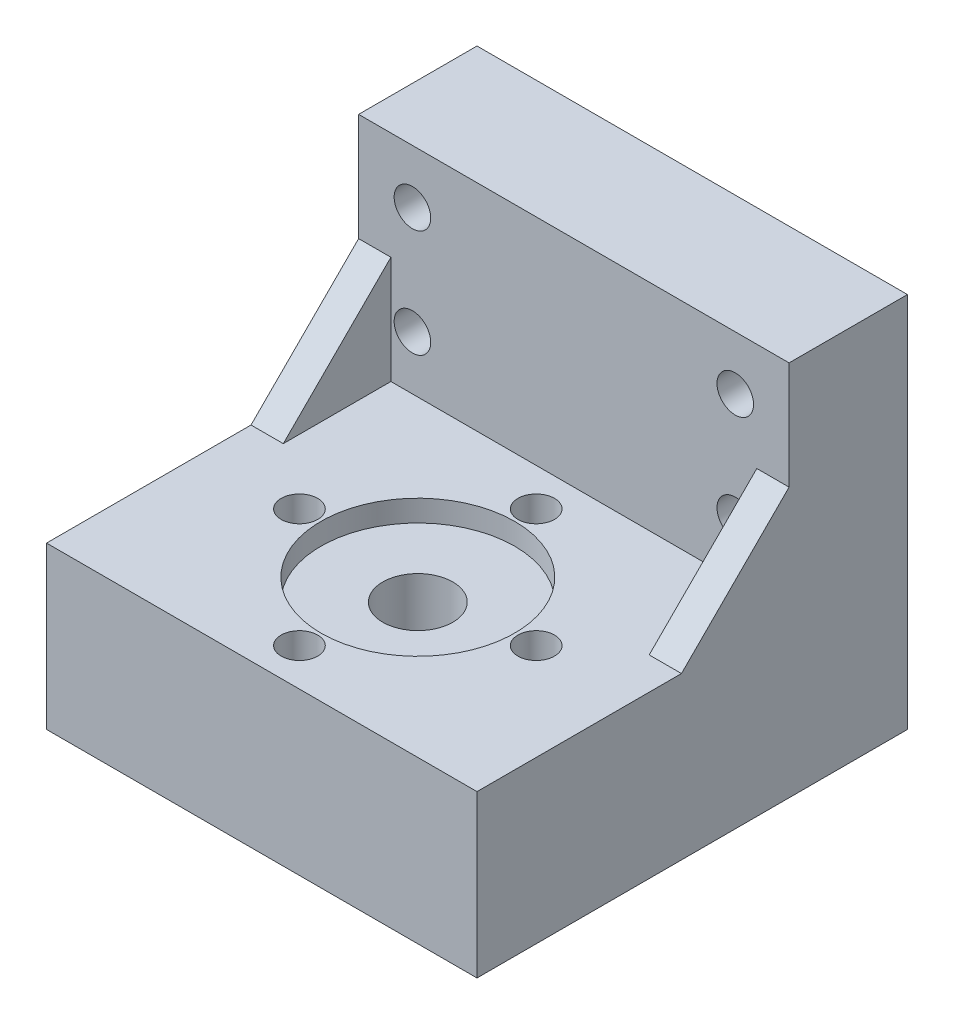
ISO-10303-21;
HEADER;
FILE_DESCRIPTION(('STEP AP214'),'2;1');
FILE_NAME('part.step','',(''),(''),'','','');
FILE_SCHEMA(('AUTOMOTIVE_DESIGN { 1 0 10303 214 1 1 1 1 }'));
ENDSEC;
DATA;
#1=APPLICATION_CONTEXT('core data for automotive mechanical design processes');
#2=APPLICATION_PROTOCOL_DEFINITION('international standard','automotive_design',2000,#1);
#3=PRODUCT_CONTEXT('',#1,'mechanical');
#4=PRODUCT('Part','Part','',(#3));
#5=PRODUCT_RELATED_PRODUCT_CATEGORY('part','',(#4));
#6=PRODUCT_DEFINITION_FORMATION('','',#4);
#7=PRODUCT_DEFINITION_CONTEXT('part definition',#1,'design');
#8=PRODUCT_DEFINITION('design','',#6,#7);
#9=PRODUCT_DEFINITION_SHAPE('','',#8);
#10=(LENGTH_UNIT() NAMED_UNIT(*) SI_UNIT(.MILLI.,.METRE.));
#11=(NAMED_UNIT(*) PLANE_ANGLE_UNIT() SI_UNIT($,.RADIAN.));
#12=(NAMED_UNIT(*) SI_UNIT($,.STERADIAN.) SOLID_ANGLE_UNIT());
#13=UNCERTAINTY_MEASURE_WITH_UNIT(LENGTH_MEASURE(1.E-05),#10,'distance_accuracy_value','');
#14=(GEOMETRIC_REPRESENTATION_CONTEXT(3) GLOBAL_UNCERTAINTY_ASSIGNED_CONTEXT((#13)) GLOBAL_UNIT_ASSIGNED_CONTEXT((#10,
#11,#12)) REPRESENTATION_CONTEXT('',''));
#15=CARTESIAN_POINT('',(0.,0.,0.));
#16=DIRECTION('',(0.,0.,1.));
#17=DIRECTION('',(1.,0.,0.));
#18=AXIS2_PLACEMENT_3D('',#15,#16,#17);
#19=CARTESIAN_POINT('',(40.,15.,-29.));
#20=DIRECTION('',(0.,0.,1.));
#21=DIRECTION('',(1.,0.,0.));
#22=AXIS2_PLACEMENT_3D('',#19,#20,#21);
#23=PLANE('',#22);
#24=DIRECTION('',(-1.,0.,0.));
#25=VECTOR('',#24,1.);
#26=CARTESIAN_POINT('',(3.,25.,-29.));
#27=LINE('',#26,#25);
#28=CARTESIAN_POINT('',(3.,25.,-29.));
#29=VERTEX_POINT('',#28);
#30=CARTESIAN_POINT('',(0.,25.,-29.));
#31=VERTEX_POINT('',#30);
#32=EDGE_CURVE('E131',#29,#31,#27,.T.);
#33=ORIENTED_EDGE('',*,*,#32,.F.);
#34=DIRECTION('',(0.,1.,0.));
#35=VECTOR('',#34,1.);
#36=CARTESIAN_POINT('',(3.,25.,-29.));
#37=LINE('',#36,#35);
#38=CARTESIAN_POINT('',(3.,15.,-29.));
#39=VERTEX_POINT('',#38);
#40=EDGE_CURVE('E124',#39,#29,#37,.T.);
#41=ORIENTED_EDGE('',*,*,#40,.F.);
#42=DIRECTION('',(-1.,0.,0.));
#43=VECTOR('',#42,1.);
#44=CARTESIAN_POINT('',(40.,15.,-29.));
#45=LINE('',#44,#43);
#46=CARTESIAN_POINT('',(37.,15.,-29.));
#47=VERTEX_POINT('',#46);
#48=EDGE_CURVE('E139',#47,#39,#45,.T.);
#49=ORIENTED_EDGE('',*,*,#48,.F.);
#50=DIRECTION('',(0.,1.,0.));
#51=VECTOR('',#50,1.);
#52=CARTESIAN_POINT('',(37.,25.,-29.));
#53=LINE('',#52,#51);
#54=CARTESIAN_POINT('',(37.,25.,-29.));
#55=VERTEX_POINT('',#54);
#56=EDGE_CURVE('E63',#47,#55,#53,.T.);
#57=ORIENTED_EDGE('',*,*,#56,.T.);
#58=DIRECTION('',(1.,0.,0.));
#59=VECTOR('',#58,1.);
#60=CARTESIAN_POINT('',(37.,25.,-29.));
#61=LINE('',#60,#59);
#62=CARTESIAN_POINT('',(40.,25.,-29.));
#63=VERTEX_POINT('',#62);
#64=EDGE_CURVE('E147',#55,#63,#61,.T.);
#65=ORIENTED_EDGE('',*,*,#64,.T.);
#66=DIRECTION('',(0.,1.,0.));
#67=VECTOR('',#66,1.);
#68=CARTESIAN_POINT('',(40.,15.,-29.));
#69=LINE('',#68,#67);
#70=CARTESIAN_POINT('',(40.,35.,-29.));
#71=VERTEX_POINT('',#70);
#72=EDGE_CURVE('E223',#63,#71,#69,.T.);
#73=ORIENTED_EDGE('',*,*,#72,.T.);
#74=DIRECTION('',(-1.,0.,0.));
#75=VECTOR('',#74,1.);
#76=CARTESIAN_POINT('',(40.,35.,-29.));
#77=LINE('',#76,#75);
#78=CARTESIAN_POINT('',(0.,35.,-29.));
#79=VERTEX_POINT('',#78);
#80=EDGE_CURVE('E255',#71,#79,#77,.T.);
#81=ORIENTED_EDGE('',*,*,#80,.T.);
#82=DIRECTION('',(0.,1.,0.));
#83=VECTOR('',#82,1.);
#84=CARTESIAN_POINT('',(0.,15.,-29.));
#85=LINE('',#84,#83);
#86=EDGE_CURVE('E237',#31,#79,#85,.T.);
#87=ORIENTED_EDGE('',*,*,#86,.F.);
#88=EDGE_LOOP('',(#33,#41,#49,#57,#65,#73,#81,#87));
#89=FACE_BOUND('',#88,.T.);
#90=CARTESIAN_POINT('',(35.,30.,-29.));
#91=DIRECTION('',(0.,0.,1.));
#92=DIRECTION('',(1.,0.,0.));
#93=AXIS2_PLACEMENT_3D('',#90,#91,#92);
#94=CIRCLE('',#93,1.7);
#95=CARTESIAN_POINT('',(36.7,30.,-29.));
#96=VERTEX_POINT('',#95);
#97=EDGE_CURVE('E165',#96,#96,#94,.T.);
#98=ORIENTED_EDGE('',*,*,#97,.F.);
#99=EDGE_LOOP('',(#98));
#100=FACE_BOUND('',#99,.T.);
#101=CARTESIAN_POINT('',(5.,20.,-29.));
#102=DIRECTION('',(0.,0.,1.));
#103=DIRECTION('',(1.,0.,0.));
#104=AXIS2_PLACEMENT_3D('',#101,#102,#103);
#105=CIRCLE('',#104,1.7);
#106=CARTESIAN_POINT('',(6.7,20.,-29.));
#107=VERTEX_POINT('',#106);
#108=EDGE_CURVE('E171',#107,#107,#105,.T.);
#109=ORIENTED_EDGE('',*,*,#108,.F.);
#110=EDGE_LOOP('',(#109));
#111=FACE_BOUND('',#110,.T.);
#112=CARTESIAN_POINT('',(35.,20.,-29.));
#113=DIRECTION('',(0.,0.,1.));
#114=DIRECTION('',(1.,0.,0.));
#115=AXIS2_PLACEMENT_3D('',#112,#113,#114);
#116=CIRCLE('',#115,1.7);
#117=CARTESIAN_POINT('',(36.7,20.,-29.));
#118=VERTEX_POINT('',#117);
#119=EDGE_CURVE('E160',#118,#118,#116,.T.);
#120=ORIENTED_EDGE('',*,*,#119,.F.);
#121=EDGE_LOOP('',(#120));
#122=FACE_BOUND('',#121,.T.);
#123=CARTESIAN_POINT('',(5.,30.,-29.));
#124=DIRECTION('',(0.,0.,1.));
#125=DIRECTION('',(1.,0.,0.));
#126=AXIS2_PLACEMENT_3D('',#123,#124,#125);
#127=CIRCLE('',#126,1.7);
#128=CARTESIAN_POINT('',(6.7,30.,-29.));
#129=VERTEX_POINT('',#128);
#130=EDGE_CURVE('E170',#129,#129,#127,.T.);
#131=ORIENTED_EDGE('',*,*,#130,.F.);
#132=EDGE_LOOP('',(#131));
#133=FACE_BOUND('',#132,.T.);
#134=ADVANCED_FACE('F39',(#89,#100,#111,#122,#133),#23,.T.);
#135=CARTESIAN_POINT('',(40.,0.,0.));
#136=DIRECTION('',(0.,0.,1.));
#137=DIRECTION('',(1.,0.,0.));
#138=AXIS2_PLACEMENT_3D('',#135,#136,#137);
#139=PLANE('',#138);
#140=DIRECTION('',(0.,1.,0.));
#141=VECTOR('',#140,1.);
#142=CARTESIAN_POINT('',(0.,0.,0.));
#143=LINE('',#142,#141);
#144=CARTESIAN_POINT('',(0.,0.,0.));
#145=VERTEX_POINT('',#144);
#146=CARTESIAN_POINT('',(0.,15.,0.));
#147=VERTEX_POINT('',#146);
#148=EDGE_CURVE('E212',#145,#147,#143,.T.);
#149=ORIENTED_EDGE('',*,*,#148,.F.);
#150=DIRECTION('',(-1.,0.,0.));
#151=VECTOR('',#150,1.);
#152=CARTESIAN_POINT('',(40.,0.,0.));
#153=LINE('',#152,#151);
#154=CARTESIAN_POINT('',(40.,0.,0.));
#155=VERTEX_POINT('',#154);
#156=EDGE_CURVE('E11',#155,#145,#153,.T.);
#157=ORIENTED_EDGE('',*,*,#156,.F.);
#158=DIRECTION('',(0.,1.,0.));
#159=VECTOR('',#158,1.);
#160=CARTESIAN_POINT('',(40.,0.,0.));
#161=LINE('',#160,#159);
#162=CARTESIAN_POINT('',(40.,15.,0.));
#163=VERTEX_POINT('',#162);
#164=EDGE_CURVE('E218',#155,#163,#161,.T.);
#165=ORIENTED_EDGE('',*,*,#164,.T.);
#166=DIRECTION('',(-1.,0.,0.));
#167=VECTOR('',#166,1.);
#168=CARTESIAN_POINT('',(40.,15.,0.));
#169=LINE('',#168,#167);
#170=EDGE_CURVE('E43',#163,#147,#169,.T.);
#171=ORIENTED_EDGE('',*,*,#170,.T.);
#172=EDGE_LOOP('',(#149,#157,#165,#171));
#173=FACE_BOUND('',#172,.T.);
#174=ADVANCED_FACE('F41',(#173),#139,.T.);
#175=CARTESIAN_POINT('',(40.,0.,0.));
#176=DIRECTION('',(0.,1.,0.));
#177=DIRECTION('',(0.,0.,1.));
#178=AXIS2_PLACEMENT_3D('',#175,#176,#177);
#179=PLANE('',#178);
#180=CARTESIAN_POINT('',(31.,0.,-14.5));
#181=DIRECTION('',(0.,1.,0.));
#182=DIRECTION('',(0.,0.,1.));
#183=AXIS2_PLACEMENT_3D('',#180,#181,#182);
#184=CIRCLE('',#183,1.7);
#185=CARTESIAN_POINT('',(31.,0.,-12.8));
#186=VERTEX_POINT('',#185);
#187=EDGE_CURVE('E185',#186,#186,#184,.T.);
#188=ORIENTED_EDGE('',*,*,#187,.T.);
#189=EDGE_LOOP('',(#188));
#190=FACE_BOUND('',#189,.T.);
#191=CARTESIAN_POINT('',(20.,0.,-25.5));
#192=DIRECTION('',(0.,1.,0.));
#193=DIRECTION('',(0.,0.,1.));
#194=AXIS2_PLACEMENT_3D('',#191,#192,#193);
#195=CIRCLE('',#194,1.7);
#196=CARTESIAN_POINT('',(20.,0.,-23.8));
#197=VERTEX_POINT('',#196);
#198=EDGE_CURVE('E191',#197,#197,#195,.T.);
#199=ORIENTED_EDGE('',*,*,#198,.T.);
#200=EDGE_LOOP('',(#199));
#201=FACE_BOUND('',#200,.T.);
#202=CARTESIAN_POINT('',(9.,0.,-14.5));
#203=DIRECTION('',(0.,1.,0.));
#204=DIRECTION('',(0.,0.,1.));
#205=AXIS2_PLACEMENT_3D('',#202,#203,#204);
#206=CIRCLE('',#205,1.7);
#207=CARTESIAN_POINT('',(9.,0.,-12.8));
#208=VERTEX_POINT('',#207);
#209=EDGE_CURVE('E198',#208,#208,#206,.T.);
#210=ORIENTED_EDGE('',*,*,#209,.T.);
#211=EDGE_LOOP('',(#210));
#212=FACE_BOUND('',#211,.T.);
#213=CARTESIAN_POINT('',(20.,0.,-3.50000000000001));
#214=DIRECTION('',(0.,1.,0.));
#215=DIRECTION('',(0.,0.,1.));
#216=AXIS2_PLACEMENT_3D('',#213,#214,#215);
#217=CIRCLE('',#216,1.7);
#218=CARTESIAN_POINT('',(20.,0.,-1.80000000000001));
#219=VERTEX_POINT('',#218);
#220=EDGE_CURVE('E177',#219,#219,#217,.T.);
#221=ORIENTED_EDGE('',*,*,#220,.T.);
#222=EDGE_LOOP('',(#221));
#223=FACE_BOUND('',#222,.T.);
#224=CARTESIAN_POINT('',(20.,0.,-14.5));
#225=DIRECTION('',(0.,1.,0.));
#226=DIRECTION('',(0.,0.,1.));
#227=AXIS2_PLACEMENT_3D('',#224,#225,#226);
#228=CIRCLE('',#227,3.25);
#229=CARTESIAN_POINT('',(20.,0.,-11.25));
#230=VERTEX_POINT('',#229);
#231=EDGE_CURVE('E207',#230,#230,#228,.T.);
#232=ORIENTED_EDGE('',*,*,#231,.T.);
#233=EDGE_LOOP('',(#232));
#234=FACE_BOUND('',#233,.T.);
#235=DIRECTION('',(0.,0.,-1.));
#236=VECTOR('',#235,1.);
#237=CARTESIAN_POINT('',(0.,0.,0.));
#238=LINE('',#237,#236);
#239=CARTESIAN_POINT('',(0.,0.,-40.));
#240=VERTEX_POINT('',#239);
#241=EDGE_CURVE('E224',#145,#240,#238,.T.);
#242=ORIENTED_EDGE('',*,*,#241,.T.);
#243=DIRECTION('',(-1.,0.,0.));
#244=VECTOR('',#243,1.);
#245=CARTESIAN_POINT('',(40.,0.,-40.));
#246=LINE('',#245,#244);
#247=CARTESIAN_POINT('',(40.,0.,-40.));
#248=VERTEX_POINT('',#247);
#249=EDGE_CURVE('E48',#248,#240,#246,.T.);
#250=ORIENTED_EDGE('',*,*,#249,.F.);
#251=DIRECTION('',(0.,0.,-1.));
#252=VECTOR('',#251,1.);
#253=CARTESIAN_POINT('',(40.,0.,0.));
#254=LINE('',#253,#252);
#255=EDGE_CURVE('E235',#155,#248,#254,.T.);
#256=ORIENTED_EDGE('',*,*,#255,.F.);
#257=ORIENTED_EDGE('',*,*,#156,.T.);
#258=EDGE_LOOP('',(#242,#250,#256,#257));
#259=FACE_BOUND('',#258,.T.);
#260=ADVANCED_FACE('F264',(#190,#201,#212,#223,#234,#259),#179,.F.);
#261=CARTESIAN_POINT('',(40.,0.,-40.));
#262=DIRECTION('',(0.,0.,1.));
#263=DIRECTION('',(0.,-1.,0.));
#264=AXIS2_PLACEMENT_3D('',#261,#262,#263);
#265=PLANE('',#264);
#266=CARTESIAN_POINT('',(35.,30.,-40.));
#267=DIRECTION('',(0.,0.,1.));
#268=DIRECTION('',(1.,0.,0.));
#269=AXIS2_PLACEMENT_3D('',#266,#267,#268);
#270=CIRCLE('',#269,1.7);
#271=CARTESIAN_POINT('',(36.7,30.,-40.));
#272=VERTEX_POINT('',#271);
#273=EDGE_CURVE('E166',#272,#272,#270,.T.);
#274=ORIENTED_EDGE('',*,*,#273,.T.);
#275=EDGE_LOOP('',(#274));
#276=FACE_BOUND('',#275,.T.);
#277=CARTESIAN_POINT('',(5.,20.,-40.));
#278=DIRECTION('',(0.,0.,1.));
#279=DIRECTION('',(1.,0.,0.));
#280=AXIS2_PLACEMENT_3D('',#277,#278,#279);
#281=CIRCLE('',#280,1.7);
#282=CARTESIAN_POINT('',(6.7,20.,-40.));
#283=VERTEX_POINT('',#282);
#284=EDGE_CURVE('E163',#283,#283,#281,.T.);
#285=ORIENTED_EDGE('',*,*,#284,.T.);
#286=EDGE_LOOP('',(#285));
#287=FACE_BOUND('',#286,.T.);
#288=CARTESIAN_POINT('',(35.,20.,-40.));
#289=DIRECTION('',(0.,0.,1.));
#290=DIRECTION('',(1.,0.,0.));
#291=AXIS2_PLACEMENT_3D('',#288,#289,#290);
#292=CIRCLE('',#291,1.7);
#293=CARTESIAN_POINT('',(36.7,20.,-40.));
#294=VERTEX_POINT('',#293);
#295=EDGE_CURVE('E154',#294,#294,#292,.T.);
#296=ORIENTED_EDGE('',*,*,#295,.T.);
#297=EDGE_LOOP('',(#296));
#298=FACE_BOUND('',#297,.T.);
#299=CARTESIAN_POINT('',(5.,30.,-40.));
#300=DIRECTION('',(0.,0.,1.));
#301=DIRECTION('',(1.,0.,0.));
#302=AXIS2_PLACEMENT_3D('',#299,#300,#301);
#303=CIRCLE('',#302,1.7);
#304=CARTESIAN_POINT('',(6.7,30.,-40.));
#305=VERTEX_POINT('',#304);
#306=EDGE_CURVE('E176',#305,#305,#303,.T.);
#307=ORIENTED_EDGE('',*,*,#306,.T.);
#308=EDGE_LOOP('',(#307));
#309=FACE_BOUND('',#308,.T.);
#310=DIRECTION('',(0.,1.,0.));
#311=VECTOR('',#310,1.);
#312=CARTESIAN_POINT('',(0.,0.,-40.));
#313=LINE('',#312,#311);
#314=CARTESIAN_POINT('',(0.,35.,-40.));
#315=VERTEX_POINT('',#314);
#316=EDGE_CURVE('E242',#240,#315,#313,.T.);
#317=ORIENTED_EDGE('',*,*,#316,.T.);
#318=DIRECTION('',(-1.,0.,0.));
#319=VECTOR('',#318,1.);
#320=CARTESIAN_POINT('',(40.,35.,-40.));
#321=LINE('',#320,#319);
#322=CARTESIAN_POINT('',(40.,35.,-40.));
#323=VERTEX_POINT('',#322);
#324=EDGE_CURVE('E248',#323,#315,#321,.T.);
#325=ORIENTED_EDGE('',*,*,#324,.F.);
#326=DIRECTION('',(0.,1.,0.));
#327=VECTOR('',#326,1.);
#328=CARTESIAN_POINT('',(40.,15.,-40.));
#329=LINE('',#328,#327);
#330=EDGE_CURVE('E229',#248,#323,#329,.T.);
#331=ORIENTED_EDGE('',*,*,#330,.F.);
#332=ORIENTED_EDGE('',*,*,#249,.T.);
#333=EDGE_LOOP('',(#317,#325,#331,#332));
#334=FACE_BOUND('',#333,.T.);
#335=ADVANCED_FACE('F270',(#276,#287,#298,#309,#334),#265,.F.);
#336=CARTESIAN_POINT('',(40.,35.,-40.));
#337=DIRECTION('',(0.,-1.,0.));
#338=DIRECTION('',(0.,0.,-1.));
#339=AXIS2_PLACEMENT_3D('',#336,#337,#338);
#340=PLANE('',#339);
#341=DIRECTION('',(0.,0.,1.));
#342=VECTOR('',#341,1.);
#343=CARTESIAN_POINT('',(0.,35.,-40.));
#344=LINE('',#343,#342);
#345=EDGE_CURVE('E241',#315,#79,#344,.T.);
#346=ORIENTED_EDGE('',*,*,#345,.T.);
#347=ORIENTED_EDGE('',*,*,#80,.F.);
#348=DIRECTION('',(0.,0.,1.));
#349=VECTOR('',#348,1.);
#350=CARTESIAN_POINT('',(40.,35.,-40.));
#351=LINE('',#350,#349);
#352=EDGE_CURVE('E227',#323,#71,#351,.T.);
#353=ORIENTED_EDGE('',*,*,#352,.F.);
#354=ORIENTED_EDGE('',*,*,#324,.T.);
#355=EDGE_LOOP('',(#346,#347,#353,#354));
#356=FACE_BOUND('',#355,.T.);
#357=ADVANCED_FACE('F283',(#356),#340,.F.);
#358=CARTESIAN_POINT('',(40.,15.,0.));
#359=DIRECTION('',(0.,1.,0.));
#360=DIRECTION('',(0.,0.,1.));
#361=AXIS2_PLACEMENT_3D('',#358,#359,#360);
#362=PLANE('',#361);
#363=DIRECTION('',(0.,0.,-1.));
#364=VECTOR('',#363,1.);
#365=CARTESIAN_POINT('',(3.,15.,-29.));
#366=LINE('',#365,#364);
#367=CARTESIAN_POINT('',(3.,15.,-19.));
#368=VERTEX_POINT('',#367);
#369=EDGE_CURVE('E122',#368,#39,#366,.T.);
#370=ORIENTED_EDGE('',*,*,#369,.F.);
#371=DIRECTION('',(-1.,0.,0.));
#372=VECTOR('',#371,1.);
#373=CARTESIAN_POINT('',(3.,15.,-19.));
#374=LINE('',#373,#372);
#375=CARTESIAN_POINT('',(0.,15.,-19.));
#376=VERTEX_POINT('',#375);
#377=EDGE_CURVE('E129',#368,#376,#374,.T.);
#378=ORIENTED_EDGE('',*,*,#377,.T.);
#379=DIRECTION('',(0.,0.,-1.));
#380=VECTOR('',#379,1.);
#381=CARTESIAN_POINT('',(0.,15.,0.));
#382=LINE('',#381,#380);
#383=EDGE_CURVE('E240',#147,#376,#382,.T.);
#384=ORIENTED_EDGE('',*,*,#383,.F.);
#385=ORIENTED_EDGE('',*,*,#170,.F.);
#386=DIRECTION('',(0.,0.,-1.));
#387=VECTOR('',#386,1.);
#388=CARTESIAN_POINT('',(40.,15.,0.));
#389=LINE('',#388,#387);
#390=CARTESIAN_POINT('',(40.,15.,-19.));
#391=VERTEX_POINT('',#390);
#392=EDGE_CURVE('E222',#163,#391,#389,.T.);
#393=ORIENTED_EDGE('',*,*,#392,.T.);
#394=DIRECTION('',(1.,0.,0.));
#395=VECTOR('',#394,1.);
#396=CARTESIAN_POINT('',(37.,15.,-19.));
#397=LINE('',#396,#395);
#398=CARTESIAN_POINT('',(37.,15.,-19.));
#399=VERTEX_POINT('',#398);
#400=EDGE_CURVE('E153',#399,#391,#397,.T.);
#401=ORIENTED_EDGE('',*,*,#400,.F.);
#402=DIRECTION('',(0.,0.,-1.));
#403=VECTOR('',#402,1.);
#404=CARTESIAN_POINT('',(37.,15.,-29.));
#405=LINE('',#404,#403);
#406=EDGE_CURVE('E144',#399,#47,#405,.T.);
#407=ORIENTED_EDGE('',*,*,#406,.T.);
#408=ORIENTED_EDGE('',*,*,#48,.T.);
#409=EDGE_LOOP('',(#370,#378,#384,#385,#393,#401,#407,#408));
#410=FACE_BOUND('',#409,.T.);
#411=CARTESIAN_POINT('',(31.,15.,-14.5));
#412=DIRECTION('',(0.,1.,0.));
#413=DIRECTION('',(0.,0.,1.));
#414=AXIS2_PLACEMENT_3D('',#411,#412,#413);
#415=CIRCLE('',#414,1.7);
#416=CARTESIAN_POINT('',(31.,15.,-12.8));
#417=VERTEX_POINT('',#416);
#418=EDGE_CURVE('E187',#417,#417,#415,.T.);
#419=ORIENTED_EDGE('',*,*,#418,.F.);
#420=EDGE_LOOP('',(#419));
#421=FACE_BOUND('',#420,.T.);
#422=CARTESIAN_POINT('',(20.,15.,-25.5));
#423=DIRECTION('',(0.,1.,0.));
#424=DIRECTION('',(0.,0.,1.));
#425=AXIS2_PLACEMENT_3D('',#422,#423,#424);
#426=CIRCLE('',#425,1.7);
#427=CARTESIAN_POINT('',(20.,15.,-23.8));
#428=VERTEX_POINT('',#427);
#429=EDGE_CURVE('E186',#428,#428,#426,.T.);
#430=ORIENTED_EDGE('',*,*,#429,.F.);
#431=EDGE_LOOP('',(#430));
#432=FACE_BOUND('',#431,.T.);
#433=CARTESIAN_POINT('',(9.,15.,-14.5));
#434=DIRECTION('',(0.,1.,0.));
#435=DIRECTION('',(0.,0.,1.));
#436=AXIS2_PLACEMENT_3D('',#433,#434,#435);
#437=CIRCLE('',#436,1.7);
#438=CARTESIAN_POINT('',(9.,15.,-12.8));
#439=VERTEX_POINT('',#438);
#440=EDGE_CURVE('E192',#439,#439,#437,.T.);
#441=ORIENTED_EDGE('',*,*,#440,.F.);
#442=EDGE_LOOP('',(#441));
#443=FACE_BOUND('',#442,.T.);
#444=CARTESIAN_POINT('',(20.,15.,-3.50000000000001));
#445=DIRECTION('',(0.,1.,0.));
#446=DIRECTION('',(0.,0.,1.));
#447=AXIS2_PLACEMENT_3D('',#444,#445,#446);
#448=CIRCLE('',#447,1.7);
#449=CARTESIAN_POINT('',(20.,15.,-1.80000000000001));
#450=VERTEX_POINT('',#449);
#451=EDGE_CURVE('E202',#450,#450,#448,.T.);
#452=ORIENTED_EDGE('',*,*,#451,.F.);
#453=EDGE_LOOP('',(#452));
#454=FACE_BOUND('',#453,.T.);
#455=CARTESIAN_POINT('',(20.,15.,-14.5));
#456=DIRECTION('',(0.,1.,0.));
#457=DIRECTION('',(0.,0.,1.));
#458=AXIS2_PLACEMENT_3D('',#455,#456,#457);
#459=CIRCLE('',#458,9.);
#460=CARTESIAN_POINT('',(20.,15.,-5.50000000000001));
#461=VERTEX_POINT('',#460);
#462=EDGE_CURVE('E209',#461,#461,#459,.T.);
#463=ORIENTED_EDGE('',*,*,#462,.F.);
#464=EDGE_LOOP('',(#463));
#465=FACE_BOUND('',#464,.T.);
#466=ADVANCED_FACE('F132',(#410,#421,#432,#443,#454,#465),#362,.T.);
#467=CARTESIAN_POINT('',(40.,0.,0.));
#468=DIRECTION('',(-1.,0.,0.));
#469=DIRECTION('',(0.,0.,1.));
#470=AXIS2_PLACEMENT_3D('',#467,#468,#469);
#471=PLANE('',#470);
#472=ORIENTED_EDGE('',*,*,#72,.F.);
#473=DIRECTION('',(0.,-0.707106781186548,0.707106781186547));
#474=VECTOR('',#473,1.);
#475=CARTESIAN_POINT('',(40.,15.,-19.));
#476=LINE('',#475,#474);
#477=EDGE_CURVE('E145',#63,#391,#476,.T.);
#478=ORIENTED_EDGE('',*,*,#477,.T.);
#479=ORIENTED_EDGE('',*,*,#392,.F.);
#480=ORIENTED_EDGE('',*,*,#164,.F.);
#481=ORIENTED_EDGE('',*,*,#255,.T.);
#482=ORIENTED_EDGE('',*,*,#330,.T.);
#483=ORIENTED_EDGE('',*,*,#352,.T.);
#484=EDGE_LOOP('',(#472,#478,#479,#480,#481,#482,#483));
#485=FACE_BOUND('',#484,.T.);
#486=ADVANCED_FACE('F271',(#485),#471,.F.);
#487=CARTESIAN_POINT('',(0.,0.,0.));
#488=DIRECTION('',(-1.,0.,0.));
#489=DIRECTION('',(0.,0.,1.));
#490=AXIS2_PLACEMENT_3D('',#487,#488,#489);
#491=PLANE('',#490);
#492=DIRECTION('',(0.,-0.707106781186548,0.707106781186547));
#493=VECTOR('',#492,1.);
#494=CARTESIAN_POINT('',(0.,15.,-19.));
#495=LINE('',#494,#493);
#496=EDGE_CURVE('E57',#31,#376,#495,.T.);
#497=ORIENTED_EDGE('',*,*,#496,.F.);
#498=ORIENTED_EDGE('',*,*,#86,.T.);
#499=ORIENTED_EDGE('',*,*,#345,.F.);
#500=ORIENTED_EDGE('',*,*,#316,.F.);
#501=ORIENTED_EDGE('',*,*,#241,.F.);
#502=ORIENTED_EDGE('',*,*,#148,.T.);
#503=ORIENTED_EDGE('',*,*,#383,.T.);
#504=EDGE_LOOP('',(#497,#498,#499,#500,#501,#502,#503));
#505=FACE_BOUND('',#504,.T.);
#506=ADVANCED_FACE('F257',(#505),#491,.T.);
#507=CARTESIAN_POINT('',(20.,13.,-14.5));
#508=DIRECTION('',(0.,1.,0.));
#509=DIRECTION('',(0.,0.,1.));
#510=AXIS2_PLACEMENT_3D('',#507,#508,#509);
#511=CYLINDRICAL_SURFACE('',#510,9.);
#512=CARTESIAN_POINT('',(20.,13.,-14.5));
#513=DIRECTION('',(0.,1.,0.));
#514=DIRECTION('',(0.,0.,1.));
#515=AXIS2_PLACEMENT_3D('',#512,#513,#514);
#516=CIRCLE('',#515,9.);
#517=CARTESIAN_POINT('',(20.,13.,-5.50000000000001));
#518=VERTEX_POINT('',#517);
#519=EDGE_CURVE('E211',#518,#518,#516,.T.);
#520=ORIENTED_EDGE('',*,*,#519,.F.);
#521=EDGE_LOOP('',(#520));
#522=FACE_BOUND('',#521,.T.);
#523=ORIENTED_EDGE('',*,*,#462,.T.);
#524=EDGE_LOOP('',(#523));
#525=FACE_BOUND('',#524,.T.);
#526=ADVANCED_FACE('F315',(#522,#525),#511,.F.);
#527=CARTESIAN_POINT('',(20.,13.,-14.5));
#528=DIRECTION('',(0.,1.,0.));
#529=DIRECTION('',(0.,0.,1.));
#530=AXIS2_PLACEMENT_3D('',#527,#528,#529);
#531=PLANE('',#530);
#532=CARTESIAN_POINT('',(20.,13.,-14.5));
#533=DIRECTION('',(0.,1.,0.));
#534=DIRECTION('',(0.,0.,1.));
#535=AXIS2_PLACEMENT_3D('',#532,#533,#534);
#536=CIRCLE('',#535,3.25);
#537=CARTESIAN_POINT('',(20.,13.,-11.25));
#538=VERTEX_POINT('',#537);
#539=EDGE_CURVE('E184',#538,#538,#536,.T.);
#540=ORIENTED_EDGE('',*,*,#539,.F.);
#541=EDGE_LOOP('',(#540));
#542=FACE_BOUND('',#541,.T.);
#543=ORIENTED_EDGE('',*,*,#519,.T.);
#544=EDGE_LOOP('',(#543));
#545=FACE_BOUND('',#544,.T.);
#546=ADVANCED_FACE('F317',(#542,#545),#531,.T.);
#547=CARTESIAN_POINT('',(20.,0.,-14.5));
#548=DIRECTION('',(0.,1.,0.));
#549=DIRECTION('',(0.,0.,1.));
#550=AXIS2_PLACEMENT_3D('',#547,#548,#549);
#551=CYLINDRICAL_SURFACE('',#550,3.25);
#552=ORIENTED_EDGE('',*,*,#231,.F.);
#553=EDGE_LOOP('',(#552));
#554=FACE_BOUND('',#553,.T.);
#555=ORIENTED_EDGE('',*,*,#539,.T.);
#556=EDGE_LOOP('',(#555));
#557=FACE_BOUND('',#556,.T.);
#558=ADVANCED_FACE('F318',(#554,#557),#551,.F.);
#559=CARTESIAN_POINT('',(20.,0.,-3.50000000000001));
#560=DIRECTION('',(0.,1.,0.));
#561=DIRECTION('',(0.,0.,1.));
#562=AXIS2_PLACEMENT_3D('',#559,#560,#561);
#563=CYLINDRICAL_SURFACE('',#562,1.7);
#564=ORIENTED_EDGE('',*,*,#220,.F.);
#565=EDGE_LOOP('',(#564));
#566=FACE_BOUND('',#565,.T.);
#567=ORIENTED_EDGE('',*,*,#451,.T.);
#568=EDGE_LOOP('',(#567));
#569=FACE_BOUND('',#568,.T.);
#570=ADVANCED_FACE('F325',(#566,#569),#563,.F.);
#571=CARTESIAN_POINT('',(9.,0.,-14.5));
#572=DIRECTION('',(0.,1.,0.));
#573=DIRECTION('',(0.,0.,1.));
#574=AXIS2_PLACEMENT_3D('',#571,#572,#573);
#575=CYLINDRICAL_SURFACE('',#574,1.7);
#576=ORIENTED_EDGE('',*,*,#209,.F.);
#577=EDGE_LOOP('',(#576));
#578=FACE_BOUND('',#577,.T.);
#579=ORIENTED_EDGE('',*,*,#440,.T.);
#580=EDGE_LOOP('',(#579));
#581=FACE_BOUND('',#580,.T.);
#582=ADVANCED_FACE('F326',(#578,#581),#575,.F.);
#583=CARTESIAN_POINT('',(20.,0.,-25.5));
#584=DIRECTION('',(0.,1.,0.));
#585=DIRECTION('',(0.,0.,1.));
#586=AXIS2_PLACEMENT_3D('',#583,#584,#585);
#587=CYLINDRICAL_SURFACE('',#586,1.7);
#588=ORIENTED_EDGE('',*,*,#198,.F.);
#589=EDGE_LOOP('',(#588));
#590=FACE_BOUND('',#589,.T.);
#591=ORIENTED_EDGE('',*,*,#429,.T.);
#592=EDGE_LOOP('',(#591));
#593=FACE_BOUND('',#592,.T.);
#594=ADVANCED_FACE('F329',(#590,#593),#587,.F.);
#595=CARTESIAN_POINT('',(31.,0.,-14.5));
#596=DIRECTION('',(0.,1.,0.));
#597=DIRECTION('',(0.,0.,1.));
#598=AXIS2_PLACEMENT_3D('',#595,#596,#597);
#599=CYLINDRICAL_SURFACE('',#598,1.7);
#600=ORIENTED_EDGE('',*,*,#187,.F.);
#601=EDGE_LOOP('',(#600));
#602=FACE_BOUND('',#601,.T.);
#603=ORIENTED_EDGE('',*,*,#418,.T.);
#604=EDGE_LOOP('',(#603));
#605=FACE_BOUND('',#604,.T.);
#606=ADVANCED_FACE('F331',(#602,#605),#599,.F.);
#607=CARTESIAN_POINT('',(5.,30.,-40.));
#608=DIRECTION('',(0.,0.,1.));
#609=DIRECTION('',(1.,0.,0.));
#610=AXIS2_PLACEMENT_3D('',#607,#608,#609);
#611=CYLINDRICAL_SURFACE('',#610,1.7);
#612=ORIENTED_EDGE('',*,*,#306,.F.);
#613=EDGE_LOOP('',(#612));
#614=FACE_BOUND('',#613,.T.);
#615=ORIENTED_EDGE('',*,*,#130,.T.);
#616=EDGE_LOOP('',(#615));
#617=FACE_BOUND('',#616,.T.);
#618=ADVANCED_FACE('F336',(#614,#617),#611,.F.);
#619=CARTESIAN_POINT('',(35.,20.,-40.));
#620=DIRECTION('',(0.,0.,1.));
#621=DIRECTION('',(1.,0.,0.));
#622=AXIS2_PLACEMENT_3D('',#619,#620,#621);
#623=CYLINDRICAL_SURFACE('',#622,1.7);
#624=ORIENTED_EDGE('',*,*,#295,.F.);
#625=EDGE_LOOP('',(#624));
#626=FACE_BOUND('',#625,.T.);
#627=ORIENTED_EDGE('',*,*,#119,.T.);
#628=EDGE_LOOP('',(#627));
#629=FACE_BOUND('',#628,.T.);
#630=ADVANCED_FACE('F341',(#626,#629),#623,.F.);
#631=CARTESIAN_POINT('',(5.,20.,-40.));
#632=DIRECTION('',(0.,0.,1.));
#633=DIRECTION('',(1.,0.,0.));
#634=AXIS2_PLACEMENT_3D('',#631,#632,#633);
#635=CYLINDRICAL_SURFACE('',#634,1.7);
#636=ORIENTED_EDGE('',*,*,#284,.F.);
#637=EDGE_LOOP('',(#636));
#638=FACE_BOUND('',#637,.T.);
#639=ORIENTED_EDGE('',*,*,#108,.T.);
#640=EDGE_LOOP('',(#639));
#641=FACE_BOUND('',#640,.T.);
#642=ADVANCED_FACE('F343',(#638,#641),#635,.F.);
#643=CARTESIAN_POINT('',(35.,30.,-40.));
#644=DIRECTION('',(0.,0.,1.));
#645=DIRECTION('',(1.,0.,0.));
#646=AXIS2_PLACEMENT_3D('',#643,#644,#645);
#647=CYLINDRICAL_SURFACE('',#646,1.7);
#648=ORIENTED_EDGE('',*,*,#273,.F.);
#649=EDGE_LOOP('',(#648));
#650=FACE_BOUND('',#649,.T.);
#651=ORIENTED_EDGE('',*,*,#97,.T.);
#652=EDGE_LOOP('',(#651));
#653=FACE_BOUND('',#652,.T.);
#654=ADVANCED_FACE('F350',(#650,#653),#647,.F.);
#655=CARTESIAN_POINT('',(37.,15.,-19.));
#656=DIRECTION('',(0.,0.707106781186547,0.707106781186548));
#657=DIRECTION('',(0.,-0.707106781186548,0.707106781186547));
#658=AXIS2_PLACEMENT_3D('',#655,#656,#657);
#659=PLANE('',#658);
#660=ORIENTED_EDGE('',*,*,#477,.F.);
#661=ORIENTED_EDGE('',*,*,#64,.F.);
#662=DIRECTION('',(0.,-0.707106781186548,0.707106781186547));
#663=VECTOR('',#662,1.);
#664=CARTESIAN_POINT('',(37.,15.,-19.));
#665=LINE('',#664,#663);
#666=EDGE_CURVE('E146',#55,#399,#665,.T.);
#667=ORIENTED_EDGE('',*,*,#666,.T.);
#668=ORIENTED_EDGE('',*,*,#400,.T.);
#669=EDGE_LOOP('',(#660,#661,#667,#668));
#670=FACE_BOUND('',#669,.T.);
#671=ADVANCED_FACE('F279',(#670),#659,.T.);
#672=CARTESIAN_POINT('',(37.,0.,0.));
#673=DIRECTION('',(1.,0.,0.));
#674=DIRECTION('',(0.,0.,-1.));
#675=AXIS2_PLACEMENT_3D('',#672,#673,#674);
#676=PLANE('',#675);
#677=ORIENTED_EDGE('',*,*,#406,.F.);
#678=ORIENTED_EDGE('',*,*,#666,.F.);
#679=ORIENTED_EDGE('',*,*,#56,.F.);
#680=EDGE_LOOP('',(#677,#678,#679));
#681=FACE_BOUND('',#680,.T.);
#682=ADVANCED_FACE('F276',(#681),#676,.F.);
#683=CARTESIAN_POINT('',(3.,15.,-19.));
#684=DIRECTION('',(0.,-0.707106781186547,-0.707106781186548));
#685=DIRECTION('',(0.,0.707106781186548,-0.707106781186547));
#686=AXIS2_PLACEMENT_3D('',#683,#684,#685);
#687=PLANE('',#686);
#688=ORIENTED_EDGE('',*,*,#496,.T.);
#689=ORIENTED_EDGE('',*,*,#377,.F.);
#690=DIRECTION('',(0.,-0.707106781186548,0.707106781186547));
#691=VECTOR('',#690,1.);
#692=CARTESIAN_POINT('',(3.,15.,-19.));
#693=LINE('',#692,#691);
#694=EDGE_CURVE('E117',#29,#368,#693,.T.);
#695=ORIENTED_EDGE('',*,*,#694,.F.);
#696=ORIENTED_EDGE('',*,*,#32,.T.);
#697=EDGE_LOOP('',(#688,#689,#695,#696));
#698=FACE_BOUND('',#697,.T.);
#699=ADVANCED_FACE('F126',(#698),#687,.F.);
#700=CARTESIAN_POINT('',(3.,0.,0.));
#701=DIRECTION('',(-1.,0.,0.));
#702=DIRECTION('',(0.,0.,-1.));
#703=AXIS2_PLACEMENT_3D('',#700,#701,#702);
#704=PLANE('',#703);
#705=ORIENTED_EDGE('',*,*,#369,.T.);
#706=ORIENTED_EDGE('',*,*,#40,.T.);
#707=ORIENTED_EDGE('',*,*,#694,.T.);
#708=EDGE_LOOP('',(#705,#706,#707));
#709=FACE_BOUND('',#708,.T.);
#710=ADVANCED_FACE('F118',(#709),#704,.F.);
#711=CLOSED_SHELL('',(#134,#174,#260,#335,#357,#466,#486,#506,#526,#546,#558,#570,#582,#594,
#606,#618,#630,#642,#654,#671,#682,#699,#710));
#712=MANIFOLD_SOLID_BREP('B2',#711);
#713=ADVANCED_BREP_SHAPE_REPRESENTATION('',(#18,#712),#14);
#714=SHAPE_DEFINITION_REPRESENTATION(#9,#713);
ENDSEC;
END-ISO-10303-21;
